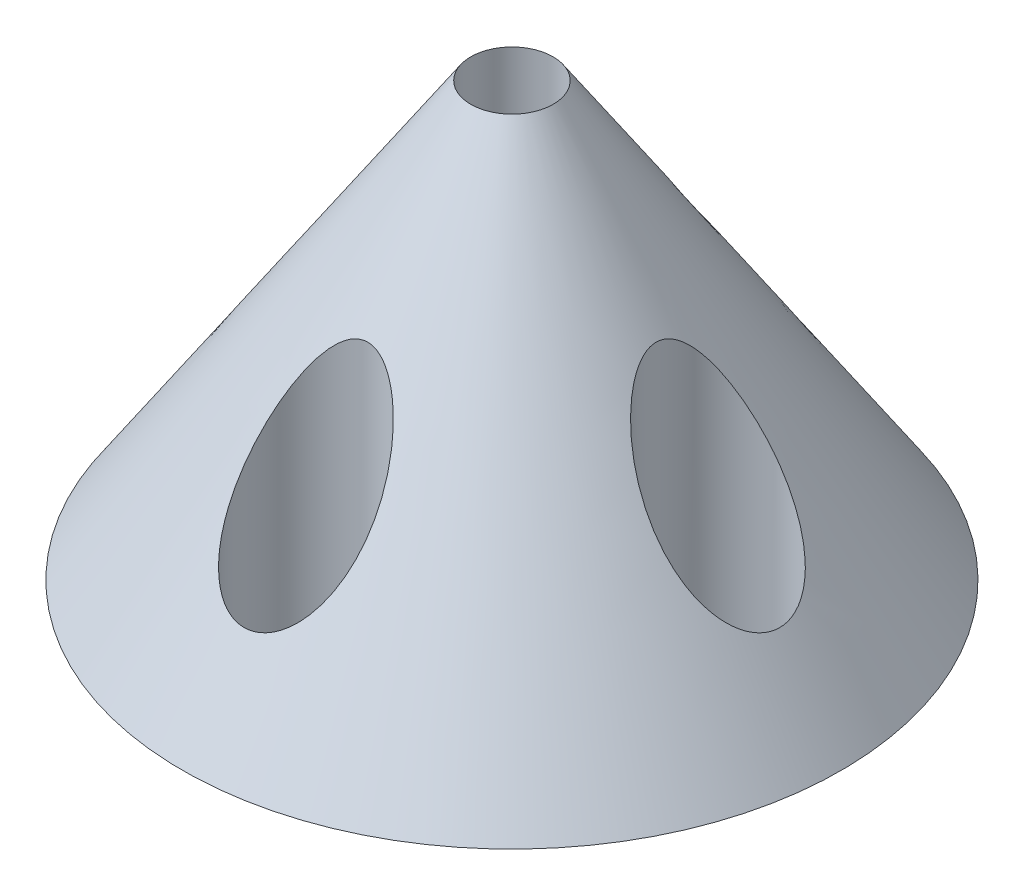
ISO-10303-21;
HEADER;
FILE_DESCRIPTION(('STEP AP214'),'2;1');
FILE_NAME('part.step','',(''),(''),'','','');
FILE_SCHEMA(('AUTOMOTIVE_DESIGN { 1 0 10303 214 1 1 1 1 }'));
ENDSEC;
DATA;
#1=APPLICATION_CONTEXT('core data for automotive mechanical design processes');
#2=APPLICATION_PROTOCOL_DEFINITION('international standard','automotive_design',2000,#1);
#3=PRODUCT_CONTEXT('',#1,'mechanical');
#4=PRODUCT('Part','Part','',(#3));
#5=PRODUCT_RELATED_PRODUCT_CATEGORY('part','',(#4));
#6=PRODUCT_DEFINITION_FORMATION('','',#4);
#7=PRODUCT_DEFINITION_CONTEXT('part definition',#1,'design');
#8=PRODUCT_DEFINITION('design','',#6,#7);
#9=PRODUCT_DEFINITION_SHAPE('','',#8);
#10=(LENGTH_UNIT() NAMED_UNIT(*) SI_UNIT(.MILLI.,.METRE.));
#11=(NAMED_UNIT(*) PLANE_ANGLE_UNIT() SI_UNIT($,.RADIAN.));
#12=(NAMED_UNIT(*) SI_UNIT($,.STERADIAN.) SOLID_ANGLE_UNIT());
#13=UNCERTAINTY_MEASURE_WITH_UNIT(LENGTH_MEASURE(1.E-05),#10,'distance_accuracy_value','');
#14=(GEOMETRIC_REPRESENTATION_CONTEXT(3) GLOBAL_UNCERTAINTY_ASSIGNED_CONTEXT((#13)) GLOBAL_UNIT_ASSIGNED_CONTEXT((#10,
#11,#12)) REPRESENTATION_CONTEXT('',''));
#15=CARTESIAN_POINT('',(0.,0.,0.));
#16=DIRECTION('',(0.,0.,1.));
#17=DIRECTION('',(1.,0.,0.));
#18=AXIS2_PLACEMENT_3D('',#15,#16,#17);
#19=CARTESIAN_POINT('',(0.,6.,0.));
#20=DIRECTION('',(0.,-1.,0.));
#21=DIRECTION('',(0.,0.,-1.));
#22=AXIS2_PLACEMENT_3D('',#19,#20,#21);
#23=CYLINDRICAL_SURFACE('',#22,0.5);
#24=CARTESIAN_POINT('',(0.,5.25000000000001,0.));
#25=DIRECTION('',(0.,-1.,0.));
#26=DIRECTION('',(0.,0.,-1.));
#27=AXIS2_PLACEMENT_3D('',#24,#25,#26);
#28=CIRCLE('',#27,0.5);
#29=CARTESIAN_POINT('',(0.,5.25000000000001,-0.499999999999997));
#30=VERTEX_POINT('',#29);
#31=EDGE_CURVE('E112',#30,#30,#28,.F.);
#32=ORIENTED_EDGE('',*,*,#31,.T.);
#33=EDGE_LOOP('',(#32));
#34=FACE_BOUND('',#33,.T.);
#35=CARTESIAN_POINT('',(0.,2.,0.));
#36=DIRECTION('',(0.,-1.,0.));
#37=DIRECTION('',(0.,0.,-1.));
#38=AXIS2_PLACEMENT_3D('',#35,#36,#37);
#39=CIRCLE('',#38,0.5);
#40=CARTESIAN_POINT('',(0.,2.,-0.5));
#41=VERTEX_POINT('',#40);
#42=EDGE_CURVE('E48',#41,#41,#39,.F.);
#43=ORIENTED_EDGE('',*,*,#42,.F.);
#44=EDGE_LOOP('',(#43));
#45=FACE_BOUND('',#44,.T.);
#46=ADVANCED_FACE('F43',(#34,#45),#23,.F.);
#47=CARTESIAN_POINT('',(0.,0.,0.));
#48=DIRECTION('',(0.,-1.,0.));
#49=DIRECTION('',(0.,0.,-1.));
#50=AXIS2_PLACEMENT_3D('',#47,#48,#49);
#51=CONICAL_SURFACE('',#50,4.,0.588002603547567);
#52=CARTESIAN_POINT('',(-3.1164051990389,1.28166517835073,-0.427252420236748));
#53=CARTESIAN_POINT('',(-3.13289975609324,1.26199988561265,-0.403451871623332));
#54=CARTESIAN_POINT('',(-3.14848680570991,1.24354229298146,-0.378027915552123));
#55=CARTESIAN_POINT('',(-3.17716684456678,1.20974585785337,-0.323856975321464));
#56=CARTESIAN_POINT('',(-3.19026019386301,1.19440656509529,-0.295110471856726));
#57=CARTESIAN_POINT('',(-3.21324260966441,1.1675794723523,-0.234209820316805));
#58=CARTESIAN_POINT('',(-3.22309474868453,1.15613601008615,-0.202021590157204));
#59=CARTESIAN_POINT('',(-3.23848525407364,1.13829599782061,-0.13529712346395));
#60=CARTESIAN_POINT('',(-3.24403035096496,1.13189157322114,-0.1007646424538));
#61=CARTESIAN_POINT('',(-3.24978453980171,1.12524768612349,-0.0353922449380311));
#62=CARTESIAN_POINT('',(-3.25060926575732,1.12429691190466,-0.00467784598215013));
#63=CARTESIAN_POINT('',(-3.24849720693905,1.12673413566165,0.0564444746885196));
#64=CARTESIAN_POINT('',(-3.24556099079994,1.13012147773697,0.0868524420336327));
#65=CARTESIAN_POINT('',(-3.23662281687779,1.14045735957081,0.143664638459654));
#66=CARTESIAN_POINT('',(-3.2309214300574,1.1470569434839,0.170182541637948));
#67=CARTESIAN_POINT('',(-3.2170109785421,1.16320729162177,0.22159767820232));
#68=CARTESIAN_POINT('',(-3.20880118972287,1.17275890804709,0.246494441077375));
#69=CARTESIAN_POINT('',(-3.18648107641935,1.19882638968878,0.304231621354519));
#70=CARTESIAN_POINT('',(-3.17133401242286,1.21658944150928,0.336108358213284));
#71=CARTESIAN_POINT('',(-3.13804371643371,1.25589782401383,0.395690785079281));
#72=CARTESIAN_POINT('',(-3.11989398999014,1.27745135963658,0.42338717953248));
#73=CARTESIAN_POINT('',(-3.07287793731002,1.33372709077257,0.486285875071207));
#74=CARTESIAN_POINT('',(-3.04287133432976,1.37000296861132,0.519236043089981));
#75=CARTESIAN_POINT('',(-2.98049426714943,1.44641243488525,0.57745117733496));
#76=CARTESIAN_POINT('',(-2.94811949182819,1.48655310316369,0.602701672161831));
#77=CARTESIAN_POINT('',(-2.86391545613303,1.59247167257,0.658681739652788));
#78=CARTESIAN_POINT('',(-2.81127236713679,1.6601010848517,0.684659142915277));
#79=CARTESIAN_POINT('',(-2.70587156759534,1.79892481071934,0.723375711664208));
#80=CARTESIAN_POINT('',(-2.65311384259961,1.87012612502522,0.736087723404634));
#81=CARTESIAN_POINT('',(-2.56342971573545,1.99444964636865,0.748272734064594));
#82=CARTESIAN_POINT('',(-2.52617640211322,2.04710011277165,0.750442309979975));
#83=CARTESIAN_POINT('',(-2.45269047260364,2.15309189743264,0.749408813379111));
#84=CARTESIAN_POINT('',(-2.41645839474596,2.20643355901138,0.746202960738412));
#85=CARTESIAN_POINT('',(-2.34525654677104,2.31352057310873,0.734749514663746));
#86=CARTESIAN_POINT('',(-2.31028859012197,2.36726638160425,0.72649496055959));
#87=CARTESIAN_POINT('',(-2.24191385454037,2.4747272623675,0.705104617379307));
#88=CARTESIAN_POINT('',(-2.20850642017938,2.52844233800737,0.691970898714217));
#89=CARTESIAN_POINT('',(-2.12883102659018,2.65957193330549,0.653818329095014));
#90=CARTESIAN_POINT('',(-2.08350721158506,2.73682203800885,0.626110924274108));
#91=CARTESIAN_POINT('',(-2.01899916624844,2.85066498764124,0.576080804739487));
#92=CARTESIAN_POINT('',(-1.99811081440121,2.88820774529766,0.558032911577849));
#93=CARTESIAN_POINT('',(-1.95761228479822,2.96229880180048,0.518761291180772));
#94=CARTESIAN_POINT('',(-1.93800116546014,2.99884782138605,0.497539942363103));
#95=CARTESIAN_POINT('',(-1.90422451979572,3.0629173912034,0.45618823152839));
#96=CARTESIAN_POINT('',(-1.88977527287964,3.09073345160008,0.436750510395949));
#97=CARTESIAN_POINT('',(-1.86200166829079,3.14493821188928,0.395078318357712));
#98=CARTESIAN_POINT('',(-1.84867979504068,3.17132371552493,0.372837926304161));
#99=CARTESIAN_POINT('',(-1.82340281778828,3.22204103263345,0.324754779638109));
#100=CARTESIAN_POINT('',(-1.8114653911369,3.24634542476693,0.298873174616041));
#101=CARTESIAN_POINT('',(-1.78983030370619,3.29090314549859,0.242999796984481));
#102=CARTESIAN_POINT('',(-1.78012268721618,3.31117442467868,0.213027285740299));
#103=CARTESIAN_POINT('',(-1.76783378653436,3.33704304448629,0.163547938159345));
#104=CARTESIAN_POINT('',(-1.76403558294227,3.34508545362715,0.145635111244287));
#105=CARTESIAN_POINT('',(-1.75767514595835,3.35859588141318,0.108649833722094));
#106=CARTESIAN_POINT('',(-1.75511142653026,3.36406699511803,0.0895788086354994));
#107=CARTESIAN_POINT('',(-1.751440715112,3.37191142379403,0.050469420026766));
#108=CARTESIAN_POINT('',(-1.75034717923827,3.3742561221162,0.0304238381156436));
#109=CARTESIAN_POINT('',(-1.74979468717513,3.37543988724289,-0.00979426283564079));
#110=CARTESIAN_POINT('',(-1.75033534570142,3.37427978035454,-0.0299667508368716));
#111=CARTESIAN_POINT('',(-1.75284683976026,3.36890564609871,-0.0677069513214652));
#112=CARTESIAN_POINT('',(-1.7546682853856,3.36501067448904,-0.085332511269774));
#113=CARTESIAN_POINT('',(-1.7594159727239,3.35489502639944,-0.119739204528683));
#114=CARTESIAN_POINT('',(-1.7623429039063,3.3486728985419,-0.136519803436465));
#115=CARTESIAN_POINT('',(-1.77107794669449,3.33019143735643,-0.178502794661599));
#116=CARTESIAN_POINT('',(-1.77757220503385,3.31652437931949,-0.202938013906715));
#117=CARTESIAN_POINT('',(-1.7921977968356,3.28603872338054,-0.249214799032616));
#118=CARTESIAN_POINT('',(-1.80033426362187,3.26921025504446,-0.271047881887309));
#119=CARTESIAN_POINT('',(-1.82498444388309,3.21876886841273,-0.329453125943648));
#120=CARTESIAN_POINT('',(-1.84287518080516,3.18275465344359,-0.363340398834715));
#121=CARTESIAN_POINT('',(-1.88117416030794,3.10728822782993,-0.425297596828623));
#122=CARTESIAN_POINT('',(-1.90158954273602,3.0678263638684,-0.453350392685652));
#123=CARTESIAN_POINT('',(-1.94433117143713,2.98694731001394,-0.504825477358852));
#124=CARTESIAN_POINT('',(-1.96665874875638,2.94552876725161,-0.528244502527056));
#125=CARTESIAN_POINT('',(-2.01289642946123,2.86153238935319,-0.571160957022437));
#126=CARTESIAN_POINT('',(-2.03680795957285,2.81895352996307,-0.590654785147954));
#127=CARTESIAN_POINT('',(-2.0860236137571,2.733084745541,-0.626134247878369));
#128=CARTESIAN_POINT('',(-2.11132915282127,2.68979413050558,-0.642116232545597));
#129=CARTESIAN_POINT('',(-2.16316858814363,2.6028443039156,-0.670760940541939));
#130=CARTESIAN_POINT('',(-2.18970295524812,2.55918495640236,-0.683422378957212));
#131=CARTESIAN_POINT('',(-2.27574722480747,2.42029193130127,-0.718524108819159));
#132=CARTESIAN_POINT('',(-2.33735145302761,2.32476671958667,-0.734961673982629));
#133=CARTESIAN_POINT('',(-2.4644622336033,2.13512001945252,-0.751888090064282));
#134=CARTESIAN_POINT('',(-2.52996053777513,2.04099605739658,-0.752409526736934));
#135=CARTESIAN_POINT('',(-2.64491048418399,1.88139727604242,-0.737477323156739));
#136=CARTESIAN_POINT('',(-2.69383784121274,1.81514334086359,-0.726364645482613));
#137=CARTESIAN_POINT('',(-2.79187001961179,1.68539039182782,-0.69282099496573));
#138=CARTESIAN_POINT('',(-2.84097497708393,1.62189449242537,-0.670377570362543));
#139=CARTESIAN_POINT('',(-2.92995458667424,1.50914284682142,-0.616378132067025));
#140=CARTESIAN_POINT('',(-2.97009344006515,1.45919342440717,-0.586737682979114));
#141=CARTESIAN_POINT('',(-3.04682005467208,1.36512927559414,-0.515935037224805));
#142=CARTESIAN_POINT('',(-3.08342649627626,1.320983351116,-0.474838494583793));
#143=CARTESIAN_POINT('',(-3.1164051990389,1.28166517835073,-0.427252420236748));
#144=B_SPLINE_CURVE_WITH_KNOTS('',3,(#52,#53,#54,#55,#56,#57,#58,#59,#60,#61,#62,#63,#64,#65,
#66,#67,#68,#69,#70,#71,#72,#73,#74,#75,#76,#77,#78,#79,#80,#81,#82,#83,#84,#85,#86,#87,#88,#89,
#90,#91,#92,#93,#94,#95,#96,#97,#98,#99,#100,#101,#102,#103,#104,#105,#106,#107,#108,#109,#110,
#111,#112,#113,#114,#115,#116,#117,#118,#119,#120,#121,#122,#123,#124,#125,#126,#127,#128,#129,
#130,#131,#132,#133,#134,#135,#136,#137,#138,#139,#140,#141,#142,#143),.UNSPECIFIED.,.T.,.F.,(4,
2,2,2,2,2,2,2,2,2,2,2,2,2,2,2,2,2,2,2,2,2,2,2,2,2,2,2,2,2,2,2,2,2,2,2,2,2,2,2,2,2,2,2,2,4),(0.,
0.104909630773148,0.20980410253638,0.315855298985923,0.421740436215652,0.513432093716302,
0.605109889554547,0.688514475279388,0.771943160986233,0.889813306049385,1.00794180759449,
1.1793720929812,1.35112262035615,1.61831094047589,1.88604511833429,2.0794113552662,
2.27287763036825,2.46661124154851,2.66026273807686,2.94067751884543,3.08037960308368,
3.21997750439235,3.33051297121375,3.44128600726293,3.55334600887162,3.66489551116995,
3.72470456242098,3.78444143615708,3.84472142253158,3.90498719816073,3.95918857476506,
4.01342381166502,4.09914894629109,4.18514631605023,4.34202878922909,4.49936554188223,
4.65681271823489,4.81440369403166,4.97215769100333,5.12997264246554,5.47331635323142,
5.81595707482899,6.06465005582016,6.31361693120166,6.52455483332345,6.73430787602759),.UNSPECIFIED.);
#145=CARTESIAN_POINT('',(-3.1164051990389,1.28166517835073,-0.427252420236748));
#146=VERTEX_POINT('',#145);
#147=EDGE_CURVE('E53',#146,#146,#144,.T.);
#148=ORIENTED_EDGE('',*,*,#147,.F.);
#149=EDGE_LOOP('',(#148));
#150=FACE_BOUND('',#149,.T.);
#151=CARTESIAN_POINT('',(3.07601697266943,1.33006253333827,-0.480317027802211));
#152=CARTESIAN_POINT('',(3.0958200916921,1.30620750859887,-0.456562133806517));
#153=CARTESIAN_POINT('',(3.11476526229245,1.28357328916843,-0.4308698423179));
#154=CARTESIAN_POINT('',(3.15013651873053,1.24157631177956,-0.37537049945589));
#155=CARTESIAN_POINT('',(3.16656565577943,1.22220958835966,-0.345568516678665));
#156=CARTESIAN_POINT('',(3.1932138972317,1.19094793803606,-0.287708749803406));
#157=CARTESIAN_POINT('',(3.20401883372179,1.17833499907016,-0.260313392247473));
#158=CARTESIAN_POINT('',(3.22258705756528,1.15672151669019,-0.203147106138909));
#159=CARTESIAN_POINT('',(3.23035222871912,1.14771873590776,-0.173377662667015));
#160=CARTESIAN_POINT('',(3.24226981735946,1.13392255182359,-0.111901754147473));
#161=CARTESIAN_POINT('',(3.24639349013175,1.12916263750635,-0.0801819549241155));
#162=CARTESIAN_POINT('',(3.25051164672324,1.12440901271458,-0.0161249188049174));
#163=CARTESIAN_POINT('',(3.25050862503675,1.12441242291718,0.0162119332736694));
#164=CARTESIAN_POINT('',(3.24664903884836,1.12886772281494,0.0761718081122196));
#165=CARTESIAN_POINT('',(3.24328166018408,1.13275490402532,0.103872164615032));
#166=CARTESIAN_POINT('',(3.2336706331588,1.14387497034348,0.158066613154024));
#167=CARTESIAN_POINT('',(3.22742651122152,1.15110840632044,0.18456050578987));
#168=CARTESIAN_POINT('',(3.21217314620844,1.16883517128024,0.236811024304234));
#169=CARTESIAN_POINT('',(3.20306586739004,1.17944427114715,0.262498976392461));
#170=CARTESIAN_POINT('',(3.18268593249973,1.20328400045078,0.311689102871206));
#171=CARTESIAN_POINT('',(3.17141220286415,1.21651592970794,0.335190184973974));
#172=CARTESIAN_POINT('',(3.13985652762706,1.25373501719115,0.393376382634722));
#173=CARTESIAN_POINT('',(3.11823958345822,1.27939890831057,0.426268774142488));
#174=CARTESIAN_POINT('',(3.07218913140902,1.334593094751,0.486353549160174));
#175=CARTESIAN_POINT('',(3.04774805321508,1.36413381236304,0.513530034531297));
#176=CARTESIAN_POINT('',(2.98412065737972,1.4418578471721,0.575313092513666));
#177=CARTESIAN_POINT('',(2.94382325345448,1.49180679675447,0.606537631903441));
#178=CARTESIAN_POINT('',(2.86166603025277,1.59550511600501,0.658842556828478));
#179=CARTESIAN_POINT('',(2.81980365844423,1.64926083485928,0.679905514375461));
#180=CARTESIAN_POINT('',(2.74546212698714,1.74660435462865,0.709548821785719));
#181=CARTESIAN_POINT('',(2.71302427834509,1.78970934012355,0.719881599414367));
#182=CARTESIAN_POINT('',(2.64839016670161,1.87696449233603,0.735927316095408));
#183=CARTESIAN_POINT('',(2.61619404476989,1.92111521504748,0.741637738101763));
#184=CARTESIAN_POINT('',(2.52032735635343,2.05478352372278,0.752487244638674));
#185=CARTESIAN_POINT('',(2.45745458160325,2.14541796302969,0.751316872737073));
#186=CARTESIAN_POINT('',(2.33273075947823,2.3318374136882,0.733939305658577));
#187=CARTESIAN_POINT('',(2.27105100624487,2.42767156096986,0.717062308687601));
#188=CARTESIAN_POINT('',(2.18262543662334,2.57072288401724,0.680281349022408));
#189=CARTESIAN_POINT('',(2.15386289318397,2.61823652823897,0.666132632596737));
#190=CARTESIAN_POINT('',(2.097819562483,2.71277889769196,0.633875387494815));
#191=CARTESIAN_POINT('',(2.07053800544631,2.75980786434403,0.615768941019472));
#192=CARTESIAN_POINT('',(2.0204669239981,2.84799883924467,0.577437043639882));
#193=CARTESIAN_POINT('',(1.99750850288553,2.88925204243508,0.557642953811585));
#194=CARTESIAN_POINT('',(1.9530848465821,2.97064613817907,0.514152592303126));
#195=CARTESIAN_POINT('',(1.93162248387166,3.010784806502,0.490449092907659));
#196=CARTESIAN_POINT('',(1.89040398920284,3.08937657000108,0.43819429118741));
#197=CARTESIAN_POINT('',(1.87066521299623,3.12781094293577,0.409600727780563));
#198=CARTESIAN_POINT('',(1.83383179077646,3.20088560912514,0.346489187111551));
#199=CARTESIAN_POINT('',(1.8167254266984,3.23554250378581,0.311998998704033));
#200=CARTESIAN_POINT('',(1.79509788086708,3.2800426495766,0.256780611132659));
#201=CARTESIAN_POINT('',(1.7888955512263,3.29290888253552,0.239169377712493));
#202=CARTESIAN_POINT('',(1.77753509751813,3.31661900502476,0.202281543616127));
#203=CARTESIAN_POINT('',(1.77237729637939,3.32746226904835,0.183004430533005));
#204=CARTESIAN_POINT('',(1.76337195900813,3.34648306674575,0.142525600495261));
#205=CARTESIAN_POINT('',(1.75954252334203,3.35462371452598,0.121301929351362));
#206=CARTESIAN_POINT('',(1.75369428599583,3.36708790756806,0.077532757849742));
#207=CARTESIAN_POINT('',(1.75167091314633,3.37142108914178,0.0549907493627717));
#208=CARTESIAN_POINT('',(1.7498104074203,3.37540560888458,0.0116951390965278));
#209=CARTESIAN_POINT('',(1.74977354884809,3.37548465938356,-0.00900982998715651));
#210=CARTESIAN_POINT('',(1.75138965313673,3.37202335646435,-0.0500516156337231));
#211=CARTESIAN_POINT('',(1.75304396683703,3.36848010970274,-0.0703881246706629));
#212=CARTESIAN_POINT('',(1.75810694711597,3.35767919853819,-0.112185956481906));
#213=CARTESIAN_POINT('',(1.76168621072469,3.35006081287252,-0.13353056279753));
#214=CARTESIAN_POINT('',(1.77029911139066,3.33184086649521,-0.174581287030251));
#215=CARTESIAN_POINT('',(1.77533539293193,3.32123388240609,-0.194284341026568));
#216=CARTESIAN_POINT('',(1.78992710151911,3.29072815075784,-0.243522388339931));
#217=CARTESIAN_POINT('',(1.80036418674371,3.26911057660571,-0.271714449680452));
#218=CARTESIAN_POINT('',(1.82314479635704,3.22258186559268,-0.324332939613682));
#219=CARTESIAN_POINT('',(1.83549369156021,3.19766147949506,-0.348748359881068));
#220=CARTESIAN_POINT('',(1.86144823898824,3.14604172037818,-0.39424542175963));
#221=CARTESIAN_POINT('',(1.87504114262364,3.11936103627834,-0.415355941666195));
#222=CARTESIAN_POINT('',(1.90330402859119,3.06468965604039,-0.455022987967733));
#223=CARTESIAN_POINT('',(1.91797501624048,3.03669774622676,-0.473577082932517));
#224=CARTESIAN_POINT('',(1.96338647256866,2.9513200011525,-0.52602054749255));
#225=CARTESIAN_POINT('',(1.99548001793196,2.8926231210448,-0.556616656825244));
#226=CARTESIAN_POINT('',(2.05847442184926,2.78072535147775,-0.607439444930379));
#227=CARTESIAN_POINT('',(2.08906522244175,2.7276983758788,-0.628465615272609));
#228=CARTESIAN_POINT('',(2.15216601110249,2.62097072551292,-0.66547022739337));
#229=CARTESIAN_POINT('',(2.18467735806053,2.56726959542362,-0.681445043043637));
#230=CARTESIAN_POINT('',(2.2513466420965,2.45970810410098,-0.708494190546553));
#231=CARTESIAN_POINT('',(2.28550356422621,2.40584785977172,-0.719571501207755));
#232=CARTESIAN_POINT('',(2.35526776233878,2.29827283452211,-0.736778305764502));
#233=CARTESIAN_POINT('',(2.39087528902894,2.24455808047228,-0.742906940539243));
#234=CARTESIAN_POINT('',(2.48652604546174,2.10330556673918,-0.752258771053166));
#235=CARTESIAN_POINT('',(2.54761574519543,2.01613509916199,-0.751108366153217));
#236=CARTESIAN_POINT('',(2.67170638459345,1.8446236641602,-0.732770943094923));
#237=CARTESIAN_POINT('',(2.73470777087295,1.76028336777438,-0.715580149176817));
#238=CARTESIAN_POINT('',(2.84609013884802,1.61528837214124,-0.667495216580966));
#239=CARTESIAN_POINT('',(2.89463661198711,1.55350668547145,-0.640450655992144));
#240=CARTESIAN_POINT('',(2.98872069441708,1.43605269926072,-0.571852959624363));
#241=CARTESIAN_POINT('',(3.03427479531962,1.3803455555337,-0.530388988535201));
#242=CARTESIAN_POINT('',(3.07601697266943,1.33006253333827,-0.480317027802211));
#243=B_SPLINE_CURVE_WITH_KNOTS('',3,(#151,#152,#153,#154,#155,#156,#157,#158,#159,#160,#161,
#162,#163,#164,#165,#166,#167,#168,#169,#170,#171,#172,#173,#174,#175,#176,#177,#178,#179,#180,
#181,#182,#183,#184,#185,#186,#187,#188,#189,#190,#191,#192,#193,#194,#195,#196,#197,#198,#199,
#200,#201,#202,#203,#204,#205,#206,#207,#208,#209,#210,#211,#212,#213,#214,#215,#216,#217,#218,
#219,#220,#221,#222,#223,#224,#225,#226,#227,#228,#229,#230,#231,#232,#233,#234,#235,#236,#237,
#238,#239,#240,#241,#242),.UNSPECIFIED.,.T.,.F.,(4,2,2,2,2,2,2,2,2,2,2,2,2,2,2,2,2,2,2,2,2,2,2,
2,2,2,2,2,2,2,2,2,2,2,2,2,2,2,2,2,2,2,2,2,2,4),(0.,0.117065414104567,0.233987718404837,
0.329724040348565,0.425400938389776,0.521826494078489,0.618193762706189,0.70232895978503,
0.786478012350678,0.873897554099062,0.961360527984515,1.10152027298084,1.24206484637629,
1.45499428238533,1.6682876237827,1.83285117580643,1.99750427868838,2.32719034731236,
2.67161325739987,2.84343549493348,3.01516755174136,3.16860097087799,3.32232130462432,
3.4774442865257,3.63185541984779,3.69974941553541,3.76766436953831,3.83647140387085,
3.90510378876173,3.96682144578748,4.02858843890948,4.0970449689142,4.16562653532657,
4.27608582799406,4.38686125971345,4.49660702446895,4.60645645895155,4.82652980683407,
5.02049957319305,5.21460826680496,5.40859873475404,5.6026228734142,5.92089158831579,
6.23923523964473,6.48750126282017,6.7342586181381),.UNSPECIFIED.);
#244=CARTESIAN_POINT('',(3.07601697266943,1.33006253333827,-0.480317027802211));
#245=VERTEX_POINT('',#244);
#246=EDGE_CURVE('E103',#245,#245,#243,.T.);
#247=ORIENTED_EDGE('',*,*,#246,.T.);
#248=EDGE_LOOP('',(#247));
#249=FACE_BOUND('',#248,.T.);
#250=CARTESIAN_POINT('',(-0.356223388553229,1.22997203996734,-3.16000371017719));
#251=CARTESIAN_POINT('',(-0.396282883251003,1.25547055746836,-3.13838127350354));
#252=CARTESIAN_POINT('',(-0.432739864920136,1.28444337520394,-3.11398944561816));
#253=CARTESIAN_POINT('',(-0.498646810929813,1.34709206248686,-3.06181624954093));
#254=CARTESIAN_POINT('',(-0.528054039764833,1.38079474480271,-3.03401568000535));
#255=CARTESIAN_POINT('',(-0.59137271505994,1.46603268704413,-2.96455595812392));
#256=CARTESIAN_POINT('',(-0.622075223558629,1.51915712114462,-2.92193971743599));
#257=CARTESIAN_POINT('',(-0.672698214653481,1.62914143920934,-2.83539887623618));
#258=CARTESIAN_POINT('',(-0.692612736904033,1.68600336872083,-2.79147356657523));
#259=CARTESIAN_POINT('',(-0.719702782394473,1.78841881581715,-2.71398387365374));
#260=CARTESIAN_POINT('',(-0.728772964432105,1.83348607337385,-2.68041280749521));
#261=CARTESIAN_POINT('',(-0.742119949061534,1.92461151703112,-2.61365187364608));
#262=CARTESIAN_POINT('',(-0.746394198524572,1.97067021764554,-2.58046221829648));
#263=CARTESIAN_POINT('',(-0.752679777342137,2.11000422170857,-2.4818085889027));
#264=CARTESIAN_POINT('',(-0.748132774142891,2.20434942730604,-2.41732678625829));
#265=CARTESIAN_POINT('',(-0.729476207942095,2.3482222983163,-2.32265850571453));
#266=CARTESIAN_POINT('',(-0.720998297679101,2.39754496157125,-2.29085498558009));
#267=CARTESIAN_POINT('',(-0.699934706662142,2.4961457869105,-2.228573066704));
#268=CARTESIAN_POINT('',(-0.687350679236446,2.54542395891428,-2.19809414020274));
#269=CARTESIAN_POINT('',(-0.658040483070765,2.64362890662833,-2.13863923172415));
#270=CARTESIAN_POINT('',(-0.641315930784271,2.69255581182044,-2.10966266855338));
#271=CARTESIAN_POINT('',(-0.603494999903941,2.78964880818038,-2.05341095981874));
#272=CARTESIAN_POINT('',(-0.582401547259365,2.83781538543992,-2.02613469135449));
#273=CARTESIAN_POINT('',(-0.533388088247564,2.93674681949986,-1.97135698588294));
#274=CARTESIAN_POINT('',(-0.505051290313636,2.98740266955026,-1.94401904175634));
#275=CARTESIAN_POINT('',(-0.457328743548395,3.06104884107463,-1.90521802085439));
#276=CARTESIAN_POINT('',(-0.44057657291039,3.08517840253641,-1.89266673949509));
#277=CARTESIAN_POINT('',(-0.405056811900744,3.13235077729581,-1.86842076212285));
#278=CARTESIAN_POINT('',(-0.386290737821082,3.15539438966386,-1.85672543265904));
#279=CARTESIAN_POINT('',(-0.347923321541105,3.19819868724124,-1.83524826874481));
#280=CARTESIAN_POINT('',(-0.328496991629237,3.21807557224338,-1.82538845419404));
#281=CARTESIAN_POINT('',(-0.287262316244256,3.25586805003669,-1.80682483880567));
#282=CARTESIAN_POINT('',(-0.265453575935473,3.27378331674175,-1.79812123011677));
#283=CARTESIAN_POINT('',(-0.2227330592493,3.30405331252921,-1.78353874062611));
#284=CARTESIAN_POINT('',(-0.202211177578119,3.31683950362397,-1.77743103045522));
#285=CARTESIAN_POINT('',(-0.15916571229104,3.33932390438095,-1.76675072617125));
#286=CARTESIAN_POINT('',(-0.136646987216788,3.34902935964233,-1.76217452868581));
#287=CARTESIAN_POINT('',(-0.0957417104566526,3.36232877091201,-1.75592456668887));
#288=CARTESIAN_POINT('',(-0.0777256587153394,3.36684332197438,-1.75381154239545));
#289=CARTESIAN_POINT('',(-0.0411126095312992,3.37306297990528,-1.75090337824433));
#290=CARTESIAN_POINT('',(-0.0225162355877802,3.37477100294091,-1.75010687043437));
#291=CARTESIAN_POINT('',(0.0147550253566803,3.37518597169516,-1.74991320814265));
#292=CARTESIAN_POINT('',(0.0334299947988986,3.37388703113703,-1.7505187983359));
#293=CARTESIAN_POINT('',(0.0702638198521033,3.36842910496238,-1.75306962894687));
#294=CARTESIAN_POINT('',(0.0884221765890175,3.36426744643514,-1.75501612136324));
#295=CARTESIAN_POINT('',(0.128910117486707,3.35194322778281,-1.76080288504402));
#296=CARTESIAN_POINT('',(0.150935709487084,3.34297380217423,-1.7650270137927));
#297=CARTESIAN_POINT('',(0.193128528647775,3.32201473110722,-1.77496620168891));
#298=CARTESIAN_POINT('',(0.213291355916556,3.31001817270293,-1.78068467449113));
#299=CARTESIAN_POINT('',(0.264634561017997,3.27518387137899,-1.79742494369464));
#300=CARTESIAN_POINT('',(0.294188217739184,3.25045388864682,-1.80943920853704));
#301=CARTESIAN_POINT('',(0.349081534067076,3.19765331126876,-1.83549472996266));
#302=CARTESIAN_POINT('',(0.374408853825914,3.16957333112648,-1.84954170605492));
#303=CARTESIAN_POINT('',(0.421734802239283,3.11127651881403,-1.87917733496065));
#304=CARTESIAN_POINT('',(0.443717778854224,3.08105055472593,-1.89477270450679));
#305=CARTESIAN_POINT('',(0.484803402809443,3.01929438446333,-1.92715751068543));
#306=CARTESIAN_POINT('',(0.50390329045578,2.98776296502673,-1.94394806901808));
#307=CARTESIAN_POINT('',(0.557549946315633,2.89179733682149,-1.99588636262261));
#308=CARTESIAN_POINT('',(0.588371419769836,2.82608764131943,-2.03255230861446));
#309=CARTESIAN_POINT('',(0.636953524448183,2.70517514298539,-2.10220012626703));
#310=CARTESIAN_POINT('',(0.656064109203495,2.65019453854613,-2.13466842730711));
#311=CARTESIAN_POINT('',(0.689056100517224,2.53976574679687,-2.20151561458333));
#312=CARTESIAN_POINT('',(0.702934110236697,2.48431727955659,-2.23589572535423));
#313=CARTESIAN_POINT('',(0.725491846011494,2.37344591083064,-2.30628412556481));
#314=CARTESIAN_POINT('',(0.734174605896512,2.31802301334653,-2.34229145153233));
#315=CARTESIAN_POINT('',(0.746175026341215,2.20752349126248,-2.41570655115475));
#316=CARTESIAN_POINT('',(0.749492434016738,2.15244688310599,-2.45311439073478));
#317=CARTESIAN_POINT('',(0.750611279466658,2.01773554433307,-2.5465706185013));
#318=CARTESIAN_POINT('',(0.745164022126103,1.93848694544036,-2.60326084286752));
#319=CARTESIAN_POINT('',(0.720108545563122,1.78306317229101,-2.71763837027167));
#320=CARTESIAN_POINT('',(0.700534910707947,1.70688097084619,-2.77532290299948));
#321=CARTESIAN_POINT('',(0.65479781044891,1.58769909764679,-2.86783672701632));
#322=CARTESIAN_POINT('',(0.633895705883385,1.54301164900751,-2.90308861797647));
#323=CARTESIAN_POINT('',(0.584342439253558,1.45679492558593,-2.97206612430889));
#324=CARTESIAN_POINT('',(0.555700098762823,1.41526212405288,-3.00579342649267));
#325=CARTESIAN_POINT('',(0.498560640775309,1.34773245795716,-3.06130256717241));
#326=CARTESIAN_POINT('',(0.472157269750002,1.3205890851822,-3.0838323947712));
#327=CARTESIAN_POINT('',(0.414247373072185,1.2698818655143,-3.12624480156245));
#328=CARTESIAN_POINT('',(0.382749373309763,1.24631216357506,-3.14613170413183));
#329=CARTESIAN_POINT('',(0.323000981823434,1.20935469258146,-3.17750249919485));
#330=CARTESIAN_POINT('',(0.295875038395568,1.19489054034261,-3.18984808164339));
#331=CARTESIAN_POINT('',(0.238890261263523,1.16950694572512,-3.21158906533549));
#332=CARTESIAN_POINT('',(0.20903307163815,1.15858538864201,-3.22098622648943));
#333=CARTESIAN_POINT('',(0.146868333554975,1.14096376696544,-3.23618028680326));
#334=CARTESIAN_POINT('',(0.114540315912623,1.13430452295045,-3.24194236512091));
#335=CARTESIAN_POINT('',(0.0487818673031808,1.12599078074012,-3.24913974942641));
#336=CARTESIAN_POINT('',(0.0153526110848903,1.12433111352068,-3.25057952420544));
#337=CARTESIAN_POINT('',(-0.046433605655022,1.1260320032964,-3.24910575912364));
#338=CARTESIAN_POINT('',(-0.0748280528299202,1.12870432735079,-3.24678901205988));
#339=CARTESIAN_POINT('',(-0.130624556794963,1.13762111963665,-3.23907411257871));
#340=CARTESIAN_POINT('',(-0.158026113032391,1.14386736368639,-3.23367442830663));
#341=CARTESIAN_POINT('',(-0.211284855661625,1.15955693668171,-3.2201513628951));
#342=CARTESIAN_POINT('',(-0.237135761680233,1.16901235326336,-3.21201768505578));
#343=CARTESIAN_POINT('',(-0.286786323299076,1.1906114344927,-3.19350913768649));
#344=CARTESIAN_POINT('',(-0.310588084430364,1.20275229287655,-3.18313660800912));
#345=CARTESIAN_POINT('',(-0.341055301483423,1.22052057348546,-3.1680246705387));
#346=CARTESIAN_POINT('',(-0.348702829112473,1.22518508201981,-3.16406299303847));
#347=CARTESIAN_POINT('',(-0.356223388553229,1.22997203996734,-3.16000371017719));
#348=B_SPLINE_CURVE_WITH_KNOTS('',3,(#250,#251,#252,#253,#254,#255,#256,#257,#258,#259,#260,
#261,#262,#263,#264,#265,#266,#267,#268,#269,#270,#271,#272,#273,#274,#275,#276,#277,#278,#279,
#280,#281,#282,#283,#284,#285,#286,#287,#288,#289,#290,#291,#292,#293,#294,#295,#296,#297,#298,
#299,#300,#301,#302,#303,#304,#305,#306,#307,#308,#309,#310,#311,#312,#313,#314,#315,#316,#317,
#318,#319,#320,#321,#322,#323,#324,#325,#326,#327,#328,#329,#330,#331,#332,#333,#334,#335,#336,
#337,#338,#339,#340,#341,#342,#343,#344,#345,#346,#347),.UNSPECIFIED.,.T.,.F.,(4,2,2,2,2,2,2,2,
2,2,2,2,2,2,2,2,2,2,2,2,2,2,2,2,2,2,2,2,2,2,2,2,2,2,2,2,2,2,2,2,2,2,2,2,2,2,2,2,4),(0.,
0.156508449616002,0.313942930117069,0.536819618540099,0.759819320720752,0.930362977313594,
1.10099738031076,1.44259993921704,1.62038058683634,1.7980897392216,1.97572962337255,
2.15325092063264,2.34526828327193,2.44103075729203,2.53672162983908,2.6250588915454,
2.71341081561579,2.78799355365461,2.86239955765634,2.91824460560261,2.97403159009424,
3.0299278726288,3.08587641631242,3.15793083208139,3.23015130894272,3.3505665166403,
3.47132737766969,3.59263709516486,3.71406220391402,3.95729717482235,4.1570393245677,
4.35691091889218,4.55666568155173,4.75642985894159,5.0483042898069,5.33946656373561,
5.52092868299706,5.70218485516577,5.83397321714099,5.96554327007469,6.06456272114991,
6.16352295465188,6.26341729296927,6.36320831578856,6.44863524185444,6.53410465197153,
6.61989963035573,6.70560537376045,6.73498744927583),.UNSPECIFIED.);
#349=CARTESIAN_POINT('',(-0.356223388553229,1.22997203996734,-3.16000371017719));
#350=VERTEX_POINT('',#349);
#351=EDGE_CURVE('E95',#350,#350,#348,.T.);
#352=ORIENTED_EDGE('',*,*,#351,.F.);
#353=EDGE_LOOP('',(#352));
#354=FACE_BOUND('',#353,.T.);
#355=CARTESIAN_POINT('',(0.,0.,0.));
#356=DIRECTION('',(0.,-1.,0.));
#357=DIRECTION('',(0.,0.,-1.));
#358=AXIS2_PLACEMENT_3D('',#355,#356,#357);
#359=CIRCLE('',#358,4.);
#360=CARTESIAN_POINT('',(0.,0.,-4.));
#361=VERTEX_POINT('',#360);
#362=EDGE_CURVE('E11',#361,#361,#359,.T.);
#363=ORIENTED_EDGE('',*,*,#362,.F.);
#364=EDGE_LOOP('',(#363));
#365=FACE_BOUND('',#364,.T.);
#366=ORIENTED_EDGE('',*,*,#31,.F.);
#367=EDGE_LOOP('',(#366));
#368=FACE_BOUND('',#367,.T.);
#369=CARTESIAN_POINT('',(-0.356223388553227,1.22997203996734,3.16000371017719));
#370=CARTESIAN_POINT('',(-0.396282883251001,1.25547055746836,3.13838127350355));
#371=CARTESIAN_POINT('',(-0.432739864920134,1.28444337520394,3.11398944561816));
#372=CARTESIAN_POINT('',(-0.498646810929811,1.34709206248686,3.06181624954093));
#373=CARTESIAN_POINT('',(-0.528054039764831,1.38079474480271,3.03401568000536));
#374=CARTESIAN_POINT('',(-0.591372715059938,1.46603268704413,2.96455595812392));
#375=CARTESIAN_POINT('',(-0.622075223558628,1.51915712114462,2.92193971743599));
#376=CARTESIAN_POINT('',(-0.672698214653479,1.62914143920934,2.83539887623619));
#377=CARTESIAN_POINT('',(-0.692612736904031,1.68600336872083,2.79147356657524));
#378=CARTESIAN_POINT('',(-0.719702782394472,1.78841881581715,2.71398387365375));
#379=CARTESIAN_POINT('',(-0.728772964432104,1.83348607337385,2.68041280749522));
#380=CARTESIAN_POINT('',(-0.742119949061533,1.92461151703112,2.61365187364609));
#381=CARTESIAN_POINT('',(-0.746394198524572,1.97067021764554,2.58046221829649));
#382=CARTESIAN_POINT('',(-0.752679777342136,2.11000422170857,2.48180858890271));
#383=CARTESIAN_POINT('',(-0.748132774142891,2.20434942730603,2.4173267862583));
#384=CARTESIAN_POINT('',(-0.729476207942096,2.34822229831629,2.32265850571454));
#385=CARTESIAN_POINT('',(-0.720998297679102,2.39754496157124,2.2908549855801));
#386=CARTESIAN_POINT('',(-0.699934706662144,2.4961457869105,2.22857306670401));
#387=CARTESIAN_POINT('',(-0.687350679236448,2.54542395891428,2.19809414020275));
#388=CARTESIAN_POINT('',(-0.658040483070768,2.64362890662833,2.13863923172415));
#389=CARTESIAN_POINT('',(-0.641315930784275,2.69255581182043,2.10966266855338));
#390=CARTESIAN_POINT('',(-0.603494999903945,2.78964880818037,2.05341095981875));
#391=CARTESIAN_POINT('',(-0.582401547259369,2.83781538543991,2.02613469135449));
#392=CARTESIAN_POINT('',(-0.533388088247569,2.93674681949986,1.97135698588294));
#393=CARTESIAN_POINT('',(-0.505051290313642,2.98740266955026,1.94401904175634));
#394=CARTESIAN_POINT('',(-0.457328743548402,3.06104884107463,1.9052180208544));
#395=CARTESIAN_POINT('',(-0.440576572910397,3.0851784025364,1.8926667394951));
#396=CARTESIAN_POINT('',(-0.405056811900751,3.1323507772958,1.86842076212286));
#397=CARTESIAN_POINT('',(-0.386290737821089,3.15539438966386,1.85672543265904));
#398=CARTESIAN_POINT('',(-0.347923321541112,3.19819868724124,1.83524826874482));
#399=CARTESIAN_POINT('',(-0.328496991629244,3.21807557224338,1.82538845419404));
#400=CARTESIAN_POINT('',(-0.287262316244263,3.25586805003669,1.80682483880567));
#401=CARTESIAN_POINT('',(-0.265453575935479,3.27378331674175,1.79812123011677));
#402=CARTESIAN_POINT('',(-0.222733059249305,3.30405331252921,1.78353874062612));
#403=CARTESIAN_POINT('',(-0.202211177578124,3.31683950362397,1.77743103045522));
#404=CARTESIAN_POINT('',(-0.159165712291045,3.33932390438095,1.76675072617125));
#405=CARTESIAN_POINT('',(-0.136646987216793,3.34902935964234,1.76217452868581));
#406=CARTESIAN_POINT('',(-0.0957417104566578,3.36232877091201,1.75592456668887));
#407=CARTESIAN_POINT('',(-0.0777256587153447,3.36684332197438,1.75381154239545));
#408=CARTESIAN_POINT('',(-0.0411126095313044,3.37306297990528,1.75090337824434));
#409=CARTESIAN_POINT('',(-0.0225162355877854,3.37477100294092,1.75010687043437));
#410=CARTESIAN_POINT('',(0.0147550253566754,3.37518597169516,1.74991320814265));
#411=CARTESIAN_POINT('',(0.0334299947988938,3.37388703113704,1.7505187983359));
#412=CARTESIAN_POINT('',(0.0702638198520988,3.36842910496238,1.75306962894687));
#413=CARTESIAN_POINT('',(0.0884221765890131,3.36426744643515,1.75501612136324));
#414=CARTESIAN_POINT('',(0.128910117486702,3.35194322778281,1.76080288504402));
#415=CARTESIAN_POINT('',(0.150935709487079,3.34297380217423,1.7650270137927));
#416=CARTESIAN_POINT('',(0.193128528647769,3.32201473110723,1.77496620168891));
#417=CARTESIAN_POINT('',(0.21329135591655,3.31001817270293,1.78068467449113));
#418=CARTESIAN_POINT('',(0.264634561017992,3.275183871379,1.79742494369464));
#419=CARTESIAN_POINT('',(0.294188217739178,3.25045388864683,1.80943920853704));
#420=CARTESIAN_POINT('',(0.34908153406707,3.19765331126877,1.83549472996266));
#421=CARTESIAN_POINT('',(0.374408853825907,3.16957333112649,1.84954170605492));
#422=CARTESIAN_POINT('',(0.421734802239275,3.11127651881405,1.87917733496065));
#423=CARTESIAN_POINT('',(0.443717778854216,3.08105055472595,1.89477270450678));
#424=CARTESIAN_POINT('',(0.484803402809435,3.01929438446334,1.92715751068543));
#425=CARTESIAN_POINT('',(0.503903290455772,2.98776296502675,1.94394806901807));
#426=CARTESIAN_POINT('',(0.557549946315624,2.89179733682151,1.99588636262261));
#427=CARTESIAN_POINT('',(0.588371419769828,2.82608764131945,2.03255230861445));
#428=CARTESIAN_POINT('',(0.636953524448176,2.70517514298541,2.10220012626702));
#429=CARTESIAN_POINT('',(0.656064109203488,2.65019453854616,2.1346684273071));
#430=CARTESIAN_POINT('',(0.689056100517218,2.5397657467969,2.20151561458331));
#431=CARTESIAN_POINT('',(0.702934110236692,2.48431727955661,2.23589572535422));
#432=CARTESIAN_POINT('',(0.725491846011491,2.37344591083066,2.30628412556479));
#433=CARTESIAN_POINT('',(0.734174605896509,2.31802301334656,2.34229145153232));
#434=CARTESIAN_POINT('',(0.746175026341213,2.20752349126251,2.41570655115474));
#435=CARTESIAN_POINT('',(0.749492434016737,2.15244688310602,2.45311439073476));
#436=CARTESIAN_POINT('',(0.750611279466659,2.0177355443331,2.54657061850129));
#437=CARTESIAN_POINT('',(0.745164022126105,1.93848694544039,2.60326084286751));
#438=CARTESIAN_POINT('',(0.720108545563125,1.78306317229103,2.71763837027166));
#439=CARTESIAN_POINT('',(0.700534910707951,1.70688097084621,2.77532290299947));
#440=CARTESIAN_POINT('',(0.654797810448915,1.58769909764681,2.86783672701632));
#441=CARTESIAN_POINT('',(0.63389570588339,1.54301164900753,2.90308861797646));
#442=CARTESIAN_POINT('',(0.584342439253564,1.45679492558594,2.97206612430889));
#443=CARTESIAN_POINT('',(0.55570009876283,1.4152621240529,3.00579342649267));
#444=CARTESIAN_POINT('',(0.498560640775316,1.34773245795717,3.0613025671724));
#445=CARTESIAN_POINT('',(0.472157269750008,1.32058908518221,3.0838323947712));
#446=CARTESIAN_POINT('',(0.414247373072191,1.26988186551431,3.12624480156244));
#447=CARTESIAN_POINT('',(0.382749373309769,1.24631216357507,3.14613170413182));
#448=CARTESIAN_POINT('',(0.32300098182344,1.20935469258146,3.17750249919485));
#449=CARTESIAN_POINT('',(0.295875038395573,1.19489054034262,3.18984808164339));
#450=CARTESIAN_POINT('',(0.238890261263528,1.16950694572513,3.21158906533549));
#451=CARTESIAN_POINT('',(0.209033071638156,1.15858538864202,3.22098622648943));
#452=CARTESIAN_POINT('',(0.14686833355498,1.14096376696545,3.23618028680326));
#453=CARTESIAN_POINT('',(0.114540315912628,1.13430452295046,3.24194236512091));
#454=CARTESIAN_POINT('',(0.0487818673031854,1.12599078074012,3.24913974942641));
#455=CARTESIAN_POINT('',(0.0153526110848947,1.12433111352069,3.25057952420544));
#456=CARTESIAN_POINT('',(-0.0464336056550181,1.12603200329641,3.24910575912364));
#457=CARTESIAN_POINT('',(-0.0748280528299167,1.12870432735079,3.24678901205988));
#458=CARTESIAN_POINT('',(-0.13062455679496,1.13762111963665,3.23907411257871));
#459=CARTESIAN_POINT('',(-0.158026113032387,1.14386736368639,3.23367442830664));
#460=CARTESIAN_POINT('',(-0.211284855661622,1.15955693668171,3.2201513628951));
#461=CARTESIAN_POINT('',(-0.23713576168023,1.16901235326336,3.21201768505578));
#462=CARTESIAN_POINT('',(-0.286786323299072,1.19061143449271,3.19350913768649));
#463=CARTESIAN_POINT('',(-0.31058808443036,1.20275229287656,3.18313660800913));
#464=CARTESIAN_POINT('',(-0.341055301483421,1.22052057348547,3.1680246705387));
#465=CARTESIAN_POINT('',(-0.34870282911247,1.22518508201981,3.16406299303847));
#466=CARTESIAN_POINT('',(-0.356223388553227,1.22997203996734,3.16000371017719));
#467=B_SPLINE_CURVE_WITH_KNOTS('',3,(#369,#370,#371,#372,#373,#374,#375,#376,#377,#378,#379,
#380,#381,#382,#383,#384,#385,#386,#387,#388,#389,#390,#391,#392,#393,#394,#395,#396,#397,#398,
#399,#400,#401,#402,#403,#404,#405,#406,#407,#408,#409,#410,#411,#412,#413,#414,#415,#416,#417,
#418,#419,#420,#421,#422,#423,#424,#425,#426,#427,#428,#429,#430,#431,#432,#433,#434,#435,#436,
#437,#438,#439,#440,#441,#442,#443,#444,#445,#446,#447,#448,#449,#450,#451,#452,#453,#454,#455,
#456,#457,#458,#459,#460,#461,#462,#463,#464,#465,#466),.UNSPECIFIED.,.T.,.F.,(4,2,2,2,2,2,2,2,
2,2,2,2,2,2,2,2,2,2,2,2,2,2,2,2,2,2,2,2,2,2,2,2,2,2,2,2,2,2,2,2,2,2,2,2,2,2,2,2,4),(0.,
0.156508449616002,0.313942930117068,0.536819618540097,0.759819320720749,0.93036297731359,
1.10099738031076,1.44259993921703,1.62038058683633,1.79808973922159,1.97572962337254,
2.15325092063263,2.34526828327192,2.44103075729202,2.53672162983907,2.62505889154539,
2.71341081561579,2.78799355365461,2.86239955765634,2.91824460560261,2.97403159009424,
3.0299278726288,3.08587641631242,3.15793083208138,3.23015130894272,3.3505665166403,
3.47132737766968,3.59263709516484,3.71406220391401,3.95729717482233,4.15703932456768,
4.35691091889216,4.55666568155171,4.75642985894157,5.04830428980688,5.33946656373559,
5.52092868299705,5.70218485516576,5.83397321714098,5.96554327007468,6.06456272114991,
6.16352295465188,6.26341729296927,6.36320831578856,6.44863524185444,6.53410465197153,
6.61989963035573,6.70560537376045,6.73498744927583),.UNSPECIFIED.);
#468=CARTESIAN_POINT('',(-0.356223388553227,1.22997203996734,3.16000371017719));
#469=VERTEX_POINT('',#468);
#470=EDGE_CURVE('E58',#469,#469,#467,.T.);
#471=ORIENTED_EDGE('',*,*,#470,.T.);
#472=EDGE_LOOP('',(#471));
#473=FACE_BOUND('',#472,.T.);
#474=ADVANCED_FACE('F45',(#150,#249,#354,#365,#368,#473),#51,.T.);
#475=CARTESIAN_POINT('',(0.,0.,0.));
#476=DIRECTION('',(0.,-1.,0.));
#477=DIRECTION('',(0.,0.,-1.));
#478=AXIS2_PLACEMENT_3D('',#475,#476,#477);
#479=PLANE('',#478);
#480=CARTESIAN_POINT('',(0.,0.,0.));
#481=DIRECTION('',(0.,-1.,0.));
#482=DIRECTION('',(0.,0.,-1.));
#483=AXIS2_PLACEMENT_3D('',#480,#481,#482);
#484=CIRCLE('',#483,1.5);
#485=CARTESIAN_POINT('',(0.,0.,-1.5));
#486=VERTEX_POINT('',#485);
#487=EDGE_CURVE('E221',#486,#486,#484,.T.);
#488=ORIENTED_EDGE('',*,*,#487,.F.);
#489=EDGE_LOOP('',(#488));
#490=FACE_BOUND('',#489,.T.);
#491=CARTESIAN_POINT('',(-2.5,0.,0.));
#492=DIRECTION('',(0.,-1.,0.));
#493=DIRECTION('',(0.,0.,-1.));
#494=AXIS2_PLACEMENT_3D('',#491,#492,#493);
#495=CIRCLE('',#494,0.75);
#496=CARTESIAN_POINT('',(-2.5,0.,-0.75));
#497=VERTEX_POINT('',#496);
#498=EDGE_CURVE('E104',#497,#497,#495,.T.);
#499=ORIENTED_EDGE('',*,*,#498,.F.);
#500=EDGE_LOOP('',(#499));
#501=FACE_BOUND('',#500,.T.);
#502=CARTESIAN_POINT('',(2.5,0.,0.));
#503=DIRECTION('',(0.,-1.,0.));
#504=DIRECTION('',(0.,0.,-1.));
#505=AXIS2_PLACEMENT_3D('',#502,#503,#504);
#506=CIRCLE('',#505,0.75);
#507=CARTESIAN_POINT('',(2.5,0.,-0.75));
#508=VERTEX_POINT('',#507);
#509=EDGE_CURVE('E105',#508,#508,#506,.F.);
#510=ORIENTED_EDGE('',*,*,#509,.T.);
#511=EDGE_LOOP('',(#510));
#512=FACE_BOUND('',#511,.T.);
#513=CARTESIAN_POINT('',(0.,0.,-2.5));
#514=DIRECTION('',(0.,-1.,0.));
#515=DIRECTION('',(0.,0.,-1.));
#516=AXIS2_PLACEMENT_3D('',#513,#514,#515);
#517=CIRCLE('',#516,0.75);
#518=CARTESIAN_POINT('',(0.,0.,-3.25));
#519=VERTEX_POINT('',#518);
#520=EDGE_CURVE('E130',#519,#519,#517,.T.);
#521=ORIENTED_EDGE('',*,*,#520,.F.);
#522=EDGE_LOOP('',(#521));
#523=FACE_BOUND('',#522,.T.);
#524=ORIENTED_EDGE('',*,*,#362,.T.);
#525=EDGE_LOOP('',(#524));
#526=FACE_BOUND('',#525,.T.);
#527=CARTESIAN_POINT('',(0.,0.,2.5));
#528=DIRECTION('',(0.,-1.,0.));
#529=DIRECTION('',(0.,0.,-1.));
#530=AXIS2_PLACEMENT_3D('',#527,#528,#529);
#531=CIRCLE('',#530,0.75);
#532=CARTESIAN_POINT('',(0.,0.,1.75));
#533=VERTEX_POINT('',#532);
#534=EDGE_CURVE('E123',#533,#533,#531,.F.);
#535=ORIENTED_EDGE('',*,*,#534,.T.);
#536=EDGE_LOOP('',(#535));
#537=FACE_BOUND('',#536,.T.);
#538=ADVANCED_FACE('F91',(#490,#501,#512,#523,#526,#537),#479,.T.);
#539=CARTESIAN_POINT('',(0.,6.,-2.5));
#540=DIRECTION('',(0.,-1.,0.));
#541=DIRECTION('',(0.,0.,-1.));
#542=AXIS2_PLACEMENT_3D('',#539,#540,#541);
#543=CYLINDRICAL_SURFACE('',#542,0.75);
#544=ORIENTED_EDGE('',*,*,#351,.T.);
#545=EDGE_LOOP('',(#544));
#546=FACE_BOUND('',#545,.T.);
#547=ORIENTED_EDGE('',*,*,#520,.T.);
#548=EDGE_LOOP('',(#547));
#549=FACE_BOUND('',#548,.T.);
#550=ADVANCED_FACE('F87',(#546,#549),#543,.F.);
#551=CARTESIAN_POINT('',(2.5,6.,0.));
#552=DIRECTION('',(0.,-1.,0.));
#553=DIRECTION('',(0.,0.,-1.));
#554=AXIS2_PLACEMENT_3D('',#551,#552,#553);
#555=CYLINDRICAL_SURFACE('',#554,0.75);
#556=ORIENTED_EDGE('',*,*,#246,.F.);
#557=EDGE_LOOP('',(#556));
#558=FACE_BOUND('',#557,.T.);
#559=ORIENTED_EDGE('',*,*,#509,.F.);
#560=EDGE_LOOP('',(#559));
#561=FACE_BOUND('',#560,.T.);
#562=ADVANCED_FACE('F85',(#558,#561),#555,.F.);
#563=CARTESIAN_POINT('',(0.,6.,2.5));
#564=DIRECTION('',(0.,-1.,0.));
#565=DIRECTION('',(0.,0.,-1.));
#566=AXIS2_PLACEMENT_3D('',#563,#564,#565);
#567=CYLINDRICAL_SURFACE('',#566,0.75);
#568=ORIENTED_EDGE('',*,*,#470,.F.);
#569=EDGE_LOOP('',(#568));
#570=FACE_BOUND('',#569,.T.);
#571=ORIENTED_EDGE('',*,*,#534,.F.);
#572=EDGE_LOOP('',(#571));
#573=FACE_BOUND('',#572,.T.);
#574=ADVANCED_FACE('F76',(#570,#573),#567,.F.);
#575=CARTESIAN_POINT('',(-2.5,6.,0.));
#576=DIRECTION('',(0.,-1.,0.));
#577=DIRECTION('',(0.,0.,-1.));
#578=AXIS2_PLACEMENT_3D('',#575,#576,#577);
#579=CYLINDRICAL_SURFACE('',#578,0.75);
#580=ORIENTED_EDGE('',*,*,#147,.T.);
#581=EDGE_LOOP('',(#580));
#582=FACE_BOUND('',#581,.T.);
#583=ORIENTED_EDGE('',*,*,#498,.T.);
#584=EDGE_LOOP('',(#583));
#585=FACE_BOUND('',#584,.T.);
#586=ADVANCED_FACE('F70',(#582,#585),#579,.F.);
#587=CARTESIAN_POINT('',(0.,2.,0.));
#588=DIRECTION('',(0.,-1.,0.));
#589=DIRECTION('',(0.,0.,-1.));
#590=AXIS2_PLACEMENT_3D('',#587,#588,#589);
#591=PLANE('',#590);
#592=CARTESIAN_POINT('',(0.,2.,0.));
#593=DIRECTION('',(0.,-1.,0.));
#594=DIRECTION('',(0.,0.,-1.));
#595=AXIS2_PLACEMENT_3D('',#592,#593,#594);
#596=CIRCLE('',#595,1.5);
#597=CARTESIAN_POINT('',(0.,2.,-1.5));
#598=VERTEX_POINT('',#597);
#599=EDGE_CURVE('E132',#598,#598,#596,.T.);
#600=ORIENTED_EDGE('',*,*,#599,.T.);
#601=EDGE_LOOP('',(#600));
#602=FACE_BOUND('',#601,.T.);
#603=ORIENTED_EDGE('',*,*,#42,.T.);
#604=EDGE_LOOP('',(#603));
#605=FACE_BOUND('',#604,.T.);
#606=ADVANCED_FACE('F75',(#602,#605),#591,.T.);
#607=CARTESIAN_POINT('',(0.,2.,0.));
#608=DIRECTION('',(0.,-1.,0.));
#609=DIRECTION('',(0.,0.,-1.));
#610=AXIS2_PLACEMENT_3D('',#607,#608,#609);
#611=CYLINDRICAL_SURFACE('',#610,1.5);
#612=ORIENTED_EDGE('',*,*,#599,.F.);
#613=EDGE_LOOP('',(#612));
#614=FACE_BOUND('',#613,.T.);
#615=ORIENTED_EDGE('',*,*,#487,.T.);
#616=EDGE_LOOP('',(#615));
#617=FACE_BOUND('',#616,.T.);
#618=ADVANCED_FACE('F78',(#614,#617),#611,.F.);
#619=CLOSED_SHELL('',(#46,#474,#538,#550,#562,#574,#586,#606,#618));
#620=MANIFOLD_SOLID_BREP('B2',#619);
#621=ADVANCED_BREP_SHAPE_REPRESENTATION('',(#18,#620),#14);
#622=SHAPE_DEFINITION_REPRESENTATION(#9,#621);
ENDSEC;
END-ISO-10303-21;
